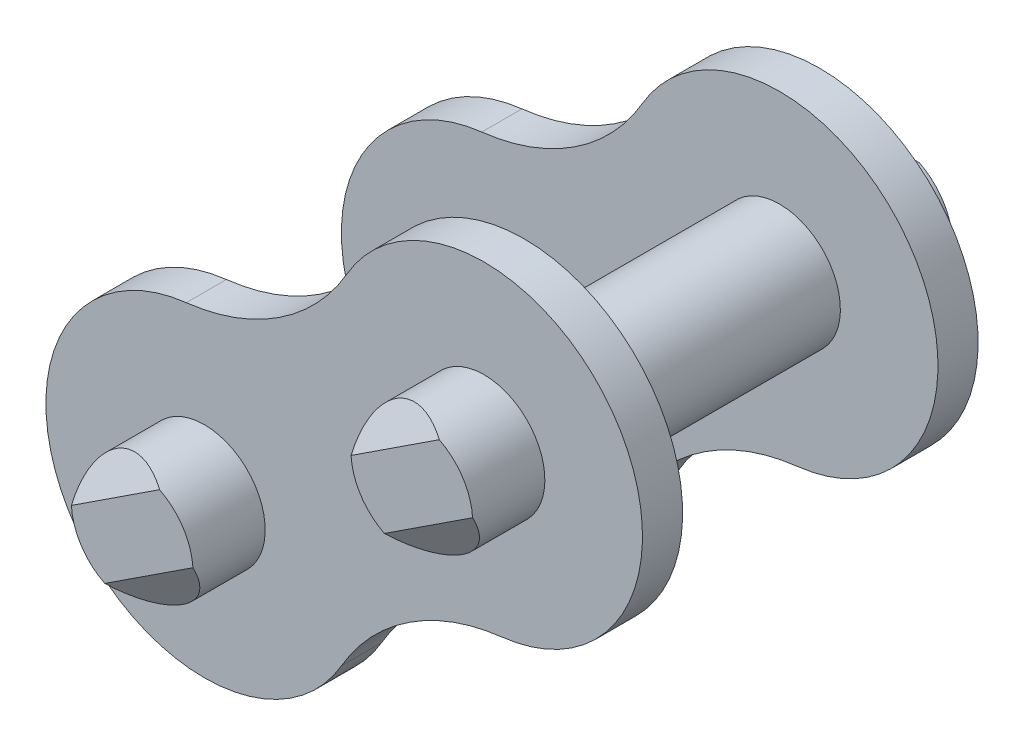
ISO-10303-21;
HEADER;
FILE_DESCRIPTION(('STEP AP214'),'2;1');
FILE_NAME('part.step','',(''),(''),'','','');
FILE_SCHEMA(('AUTOMOTIVE_DESIGN { 1 0 10303 214 1 1 1 1 }'));
ENDSEC;
DATA;
#1=APPLICATION_CONTEXT('core data for automotive mechanical design processes');
#2=APPLICATION_PROTOCOL_DEFINITION('international standard','automotive_design',2000,#1);
#3=PRODUCT_CONTEXT('',#1,'mechanical');
#4=PRODUCT('Part','Part','',(#3));
#5=PRODUCT_RELATED_PRODUCT_CATEGORY('part','',(#4));
#6=PRODUCT_DEFINITION_FORMATION('','',#4);
#7=PRODUCT_DEFINITION_CONTEXT('part definition',#1,'design');
#8=PRODUCT_DEFINITION('design','',#6,#7);
#9=PRODUCT_DEFINITION_SHAPE('','',#8);
#10=(LENGTH_UNIT() NAMED_UNIT(*) SI_UNIT(.MILLI.,.METRE.));
#11=(NAMED_UNIT(*) PLANE_ANGLE_UNIT() SI_UNIT($,.RADIAN.));
#12=(NAMED_UNIT(*) SI_UNIT($,.STERADIAN.) SOLID_ANGLE_UNIT());
#13=UNCERTAINTY_MEASURE_WITH_UNIT(LENGTH_MEASURE(1.E-05),#10,'distance_accuracy_value','');
#14=(GEOMETRIC_REPRESENTATION_CONTEXT(3) GLOBAL_UNCERTAINTY_ASSIGNED_CONTEXT((#13)) GLOBAL_UNIT_ASSIGNED_CONTEXT((#10,
#11,#12)) REPRESENTATION_CONTEXT('',''));
#15=CARTESIAN_POINT('',(0.,0.,0.));
#16=DIRECTION('',(0.,0.,1.));
#17=DIRECTION('',(1.,0.,0.));
#18=AXIS2_PLACEMENT_3D('',#15,#16,#17);
#19=CARTESIAN_POINT('',(79.0152137888915,913.622566745912,-131.392489073474));
#20=DIRECTION('',(0.273886737642536,-0.418313345404529,0.866025403784439));
#21=DIRECTION('',(-0.836626690809058,-0.547773475285072,0.));
#22=AXIS2_PLACEMENT_3D('',#19,#20,#21);
#23=PLANE('',#22);
#24=CARTESIAN_POINT('',(91.6233216253341,920.841571485645,-131.892921853051));
#25=DIRECTION('',(-0.273886737642536,0.418313345404529,-0.866025403784439));
#26=DIRECTION('',(-0.47438574511616,0.724539967724753,0.5));
#27=AXIS2_PLACEMENT_3D('',#24,#25,#26);
#28=ELLIPSE('',#27,1.3344874122049,1.1557);
#29=CARTESIAN_POINT('',(90.4694398819412,920.776768613298,-131.5593));
#30=VERTEX_POINT('',#29);
#31=CARTESIAN_POINT('',(92.1441415633402,921.87326382456,-131.5593));
#32=VERTEX_POINT('',#31);
#33=EDGE_CURVE('E254',#30,#32,#28,.T.);
#34=ORIENTED_EDGE('',*,*,#33,.T.);
#35=DIRECTION('',(0.836626690809058,0.547773475285072,0.));
#36=VECTOR('',#35,1.);
#37=CARTESIAN_POINT('',(79.1734792402382,913.38084437927,-131.5593));
#38=LINE('',#37,#36);
#39=EDGE_CURVE('E264',#30,#32,#38,.T.);
#40=ORIENTED_EDGE('',*,*,#39,.F.);
#41=EDGE_LOOP('',(#34,#40));
#42=FACE_BOUND('',#41,.T.);
#43=ADVANCED_FACE('F17',(#42),#23,.F.);
#44=CARTESIAN_POINT('',(79.9648064969719,912.172232546061,-131.392489073474));
#45=DIRECTION('',(0.273886737642537,-0.41831334540453,-0.866025403784438));
#46=DIRECTION('',(0.,-0.900457125334355,0.43494478435152));
#47=AXIS2_PLACEMENT_3D('',#44,#45,#46);
#48=PLANE('',#47);
#49=CARTESIAN_POINT('',(91.6233216253341,920.841571485645,-131.892921853051));
#50=DIRECTION('',(-0.273886737642537,0.418313345404529,0.866025403784439));
#51=DIRECTION('',(0.47438574511616,-0.724539967724752,0.5));
#52=AXIS2_PLACEMENT_3D('',#49,#50,#51);
#53=ELLIPSE('',#52,1.3344874122049,1.1557);
#54=CARTESIAN_POINT('',(91.1025016873281,919.80987914673,-131.5593));
#55=VERTEX_POINT('',#54);
#56=CARTESIAN_POINT('',(92.7772033687271,920.906374357992,-131.5593));
#57=VERTEX_POINT('',#56);
#58=EDGE_CURVE('E259',#55,#57,#53,.T.);
#59=ORIENTED_EDGE('',*,*,#58,.F.);
#60=DIRECTION('',(0.836626690809058,0.547773475285072,0.));
#61=VECTOR('',#60,1.);
#62=CARTESIAN_POINT('',(79.8065410456252,912.413954912702,-131.5593));
#63=LINE('',#62,#61);
#64=EDGE_CURVE('E267',#55,#57,#63,.T.);
#65=ORIENTED_EDGE('',*,*,#64,.T.);
#66=EDGE_LOOP('',(#59,#65));
#67=FACE_BOUND('',#66,.T.);
#68=ADVANCED_FACE('F446',(#67),#48,.T.);
#69=CARTESIAN_POINT('',(79.0152137888915,913.622566745912,-131.392489073474));
#70=DIRECTION('',(0.273886737642536,-0.418313345404529,0.866025403784439));
#71=DIRECTION('',(-0.836626690809058,-0.547773475285072,0.));
#72=AXIS2_PLACEMENT_3D('',#69,#70,#71);
#73=PLANE('',#72);
#74=CARTESIAN_POINT('',(96.9359011119717,924.319933053705,-131.892921853051));
#75=DIRECTION('',(-0.273886737642536,0.418313345404529,-0.866025403784439));
#76=DIRECTION('',(-0.47438574511616,0.724539967724753,0.5));
#77=AXIS2_PLACEMENT_3D('',#74,#75,#76);
#78=ELLIPSE('',#77,1.3344874122049,1.1557);
#79=CARTESIAN_POINT('',(95.7820193685787,924.255130181358,-131.5593));
#80=VERTEX_POINT('',#79);
#81=CARTESIAN_POINT('',(97.4567210499777,925.35162539262,-131.5593));
#82=VERTEX_POINT('',#81);
#83=EDGE_CURVE('E271',#80,#82,#78,.T.);
#84=ORIENTED_EDGE('',*,*,#83,.T.);
#85=DIRECTION('',(0.836626690809058,0.547773475285072,0.));
#86=VECTOR('',#85,1.);
#87=CARTESIAN_POINT('',(79.1734792402382,913.38084437927,-131.5593));
#88=LINE('',#87,#86);
#89=EDGE_CURVE('E293',#80,#82,#88,.T.);
#90=ORIENTED_EDGE('',*,*,#89,.F.);
#91=EDGE_LOOP('',(#84,#90));
#92=FACE_BOUND('',#91,.T.);
#93=ADVANCED_FACE('F451',(#92),#73,.F.);
#94=CARTESIAN_POINT('',(79.9648064969719,912.172232546061,-131.392489073474));
#95=DIRECTION('',(0.273886737642537,-0.41831334540453,-0.866025403784438));
#96=DIRECTION('',(0.,-0.900457125334355,0.43494478435152));
#97=AXIS2_PLACEMENT_3D('',#94,#95,#96);
#98=PLANE('',#97);
#99=CARTESIAN_POINT('',(96.9359011119717,924.319933053705,-131.892921853051));
#100=DIRECTION('',(-0.273886737642537,0.418313345404529,0.866025403784439));
#101=DIRECTION('',(0.47438574511616,-0.724539967724752,0.5));
#102=AXIS2_PLACEMENT_3D('',#99,#100,#101);
#103=ELLIPSE('',#102,1.3344874122049,1.1557);
#104=CARTESIAN_POINT('',(96.4150811739656,923.28824071479,-131.5593));
#105=VERTEX_POINT('',#104);
#106=CARTESIAN_POINT('',(98.0897828553646,924.384735926052,-131.5593));
#107=VERTEX_POINT('',#106);
#108=EDGE_CURVE('E279',#105,#107,#103,.T.);
#109=ORIENTED_EDGE('',*,*,#108,.F.);
#110=DIRECTION('',(0.836626690809058,0.547773475285072,0.));
#111=VECTOR('',#110,1.);
#112=CARTESIAN_POINT('',(79.8065410456252,912.413954912702,-131.5593));
#113=LINE('',#112,#111);
#114=EDGE_CURVE('E296',#105,#107,#113,.T.);
#115=ORIENTED_EDGE('',*,*,#114,.T.);
#116=EDGE_LOOP('',(#109,#115));
#117=FACE_BOUND('',#116,.T.);
#118=ADVANCED_FACE('F494',(#117),#98,.T.);
#119=CARTESIAN_POINT('',(94.2796113686529,922.580752269675,-129.4257));
#120=DIRECTION('',(0.,0.,-1.));
#121=DIRECTION('',(0.,-1.,0.));
#122=AXIS2_PLACEMENT_3D('',#119,#120,#121);
#123=PLANE('',#122);
#124=CARTESIAN_POINT('',(91.6233216253341,920.841571485645,-129.4257));
#125=DIRECTION('',(0.,0.,1.));
#126=DIRECTION('',(0.836626690809057,0.547773475285073,0.));
#127=AXIS2_PLACEMENT_3D('',#124,#125,#126);
#128=CIRCLE('',#127,1.1557);
#129=CARTESIAN_POINT('',(92.5902110919021,921.474633291032,-129.4257));
#130=VERTEX_POINT('',#129);
#131=EDGE_CURVE('E248',#130,#130,#128,.T.);
#132=ORIENTED_EDGE('',*,*,#131,.F.);
#133=EDGE_LOOP('',(#132));
#134=FACE_BOUND('',#133,.T.);
#135=CARTESIAN_POINT('',(96.9359011119717,924.319933053705,-129.4257));
#136=DIRECTION('',(0.,0.,1.));
#137=DIRECTION('',(0.836626690809057,0.547773475285073,0.));
#138=AXIS2_PLACEMENT_3D('',#135,#136,#137);
#139=CIRCLE('',#138,1.1557);
#140=CARTESIAN_POINT('',(97.9027905785397,924.952994859092,-129.4257));
#141=VERTEX_POINT('',#140);
#142=EDGE_CURVE('E245',#141,#141,#139,.T.);
#143=ORIENTED_EDGE('',*,*,#142,.F.);
#144=EDGE_LOOP('',(#143));
#145=FACE_BOUND('',#144,.T.);
#146=CARTESIAN_POINT('',(97.7426762179608,917.291535804008,-129.4257));
#147=DIRECTION('',(0.,0.,1.));
#148=DIRECTION('',(0.836626690809057,0.547773475285073,0.));
#149=AXIS2_PLACEMENT_3D('',#146,#147,#148);
#150=CIRCLE('',#149,4.06464973628698);
#151=CARTESIAN_POINT('',(97.2791473229724,921.329668843199,-129.4257));
#152=VERTEX_POINT('',#151);
#153=CARTESIAN_POINT('',(94.2268294208725,919.331192338354,-129.4257));
#154=VERTEX_POINT('',#153);
#155=EDGE_CURVE('E299',#152,#154,#150,.T.);
#156=ORIENTED_EDGE('',*,*,#155,.F.);
#157=CARTESIAN_POINT('',(96.9359011119717,924.319933053705,-129.4257));
#158=DIRECTION('',(0.,0.,1.));
#159=DIRECTION('',(0.836626690809057,0.547773475285073,0.));
#160=AXIS2_PLACEMENT_3D('',#157,#158,#159);
#161=CIRCLE('',#160,3.0099);
#162=CARTESIAN_POINT('',(94.3323933164333,925.830312200996,-129.4257));
#163=VERTEX_POINT('',#162);
#164=EDGE_CURVE('E234',#152,#163,#161,.T.);
#165=ORIENTED_EDGE('',*,*,#164,.T.);
#166=CARTESIAN_POINT('',(90.8165465193451,927.869968735342,-129.4257));
#167=DIRECTION('',(0.,0.,1.));
#168=DIRECTION('',(0.836626690809057,0.547773475285073,0.));
#169=AXIS2_PLACEMENT_3D('',#166,#167,#168);
#170=CIRCLE('',#169,4.06464973628691);
#171=CARTESIAN_POINT('',(91.2800754143334,923.831835696151,-129.4257));
#172=VERTEX_POINT('',#171);
#173=EDGE_CURVE('E284',#172,#163,#170,.T.);
#174=ORIENTED_EDGE('',*,*,#173,.F.);
#175=CARTESIAN_POINT('',(91.6233216253341,920.841571485645,-129.4257));
#176=DIRECTION('',(0.,0.,1.));
#177=DIRECTION('',(0.836626690809057,0.547773475285073,0.));
#178=AXIS2_PLACEMENT_3D('',#175,#176,#177);
#179=CIRCLE('',#178,3.0099);
#180=EDGE_CURVE('E25',#172,#154,#179,.T.);
#181=ORIENTED_EDGE('',*,*,#180,.T.);
#182=EDGE_LOOP('',(#156,#165,#174,#181));
#183=FACE_BOUND('',#182,.T.);
#184=ADVANCED_FACE('F490',(#134,#145,#183),#123,.F.);
#185=CARTESIAN_POINT('',(94.2796113686529,922.580752269675,-130.1877));
#186=DIRECTION('',(0.,0.,-1.));
#187=DIRECTION('',(0.,-1.,0.));
#188=AXIS2_PLACEMENT_3D('',#185,#186,#187);
#189=PLANE('',#188);
#190=CARTESIAN_POINT('',(91.6233216253341,920.841571485645,-130.1877));
#191=DIRECTION('',(0.,0.,1.));
#192=DIRECTION('',(0.836626690809057,0.547773475285073,0.));
#193=AXIS2_PLACEMENT_3D('',#190,#191,#192);
#194=CIRCLE('',#193,1.1557);
#195=CARTESIAN_POINT('',(92.5902110919021,921.474633291032,-130.1877));
#196=VERTEX_POINT('',#195);
#197=EDGE_CURVE('E251',#196,#196,#194,.T.);
#198=ORIENTED_EDGE('',*,*,#197,.T.);
#199=EDGE_LOOP('',(#198));
#200=FACE_BOUND('',#199,.T.);
#201=CARTESIAN_POINT('',(96.9359011119717,924.319933053705,-130.1877));
#202=DIRECTION('',(0.,0.,1.));
#203=DIRECTION('',(0.836626690809057,0.547773475285073,0.));
#204=AXIS2_PLACEMENT_3D('',#201,#202,#203);
#205=CIRCLE('',#204,1.1557);
#206=CARTESIAN_POINT('',(97.9027905785397,924.952994859092,-130.1877));
#207=VERTEX_POINT('',#206);
#208=EDGE_CURVE('E268',#207,#207,#205,.T.);
#209=ORIENTED_EDGE('',*,*,#208,.T.);
#210=EDGE_LOOP('',(#209));
#211=FACE_BOUND('',#210,.T.);
#212=CARTESIAN_POINT('',(97.7426762179608,917.291535804008,-130.1877));
#213=DIRECTION('',(0.,0.,1.));
#214=DIRECTION('',(0.836626690809057,0.547773475285073,0.));
#215=AXIS2_PLACEMENT_3D('',#212,#213,#214);
#216=CIRCLE('',#215,4.06464973628698);
#217=CARTESIAN_POINT('',(97.2791473229724,921.329668843199,-130.1877));
#218=VERTEX_POINT('',#217);
#219=CARTESIAN_POINT('',(94.2268294208725,919.331192338354,-130.1877));
#220=VERTEX_POINT('',#219);
#221=EDGE_CURVE('E235',#218,#220,#216,.T.);
#222=ORIENTED_EDGE('',*,*,#221,.T.);
#223=CARTESIAN_POINT('',(91.6233216253341,920.841571485645,-130.1877));
#224=DIRECTION('',(0.,0.,1.));
#225=DIRECTION('',(0.836626690809057,0.547773475285073,0.));
#226=AXIS2_PLACEMENT_3D('',#223,#224,#225);
#227=CIRCLE('',#226,3.0099);
#228=CARTESIAN_POINT('',(91.2800754143334,923.831835696151,-130.1877));
#229=VERTEX_POINT('',#228);
#230=EDGE_CURVE('E11',#229,#220,#227,.T.);
#231=ORIENTED_EDGE('',*,*,#230,.F.);
#232=CARTESIAN_POINT('',(90.8165465193451,927.869968735342,-130.1877));
#233=DIRECTION('',(0.,0.,1.));
#234=DIRECTION('',(0.836626690809057,0.547773475285073,0.));
#235=AXIS2_PLACEMENT_3D('',#232,#233,#234);
#236=CIRCLE('',#235,4.06464973628691);
#237=CARTESIAN_POINT('',(94.3323933164333,925.830312200996,-130.1877));
#238=VERTEX_POINT('',#237);
#239=EDGE_CURVE('E314',#229,#238,#236,.T.);
#240=ORIENTED_EDGE('',*,*,#239,.T.);
#241=CARTESIAN_POINT('',(96.9359011119717,924.319933053705,-130.1877));
#242=DIRECTION('',(0.,0.,1.));
#243=DIRECTION('',(0.836626690809057,0.547773475285073,0.));
#244=AXIS2_PLACEMENT_3D('',#241,#242,#243);
#245=CIRCLE('',#244,3.0099);
#246=EDGE_CURVE('E285',#218,#238,#245,.T.);
#247=ORIENTED_EDGE('',*,*,#246,.F.);
#248=EDGE_LOOP('',(#222,#231,#240,#247));
#249=FACE_BOUND('',#248,.T.);
#250=ADVANCED_FACE('F487',(#200,#211,#249),#189,.T.);
#251=CARTESIAN_POINT('',(91.6233216253341,920.841571485645,-130.1877));
#252=DIRECTION('',(0.,0.,1.));
#253=DIRECTION('',(-0.836626690809057,-0.547773475285073,0.));
#254=AXIS2_PLACEMENT_3D('',#251,#252,#253);
#255=CYLINDRICAL_SURFACE('',#254,3.0099);
#256=ORIENTED_EDGE('',*,*,#180,.F.);
#257=DIRECTION('',(0.,0.,1.));
#258=VECTOR('',#257,1.);
#259=CARTESIAN_POINT('',(91.2800754143334,923.831835696151,-130.1877));
#260=LINE('',#259,#258);
#261=EDGE_CURVE('E316',#229,#172,#260,.T.);
#262=ORIENTED_EDGE('',*,*,#261,.F.);
#263=ORIENTED_EDGE('',*,*,#230,.T.);
#264=DIRECTION('',(0.,0.,1.));
#265=VECTOR('',#264,1.);
#266=CARTESIAN_POINT('',(94.2268294208725,919.331192338354,-130.1877));
#267=LINE('',#266,#265);
#268=EDGE_CURVE('E303',#220,#154,#267,.T.);
#269=ORIENTED_EDGE('',*,*,#268,.T.);
#270=EDGE_LOOP('',(#256,#262,#263,#269));
#271=FACE_BOUND('',#270,.T.);
#272=ADVANCED_FACE('F486',(#271),#255,.T.);
#273=CARTESIAN_POINT('',(90.8165465193451,927.869968735342,-130.1877));
#274=DIRECTION('',(0.,0.,1.));
#275=DIRECTION('',(-0.836626690809057,-0.547773475285073,0.));
#276=AXIS2_PLACEMENT_3D('',#273,#274,#275);
#277=CYLINDRICAL_SURFACE('',#276,4.06464973628691);
#278=ORIENTED_EDGE('',*,*,#173,.T.);
#279=DIRECTION('',(0.,0.,1.));
#280=VECTOR('',#279,1.);
#281=CARTESIAN_POINT('',(94.3323933164333,925.830312200996,-130.1877));
#282=LINE('',#281,#280);
#283=EDGE_CURVE('E280',#238,#163,#282,.T.);
#284=ORIENTED_EDGE('',*,*,#283,.F.);
#285=ORIENTED_EDGE('',*,*,#239,.F.);
#286=ORIENTED_EDGE('',*,*,#261,.T.);
#287=EDGE_LOOP('',(#278,#284,#285,#286));
#288=FACE_BOUND('',#287,.T.);
#289=ADVANCED_FACE('F482',(#288),#277,.F.);
#290=CARTESIAN_POINT('',(96.9359011119717,924.319933053705,-130.1877));
#291=DIRECTION('',(0.,0.,1.));
#292=DIRECTION('',(-0.836626690809057,-0.547773475285073,0.));
#293=AXIS2_PLACEMENT_3D('',#290,#291,#292);
#294=CYLINDRICAL_SURFACE('',#293,3.0099);
#295=ORIENTED_EDGE('',*,*,#164,.F.);
#296=DIRECTION('',(0.,0.,1.));
#297=VECTOR('',#296,1.);
#298=CARTESIAN_POINT('',(97.2791473229724,921.329668843199,-130.1877));
#299=LINE('',#298,#297);
#300=EDGE_CURVE('E232',#218,#152,#299,.T.);
#301=ORIENTED_EDGE('',*,*,#300,.F.);
#302=ORIENTED_EDGE('',*,*,#246,.T.);
#303=ORIENTED_EDGE('',*,*,#283,.T.);
#304=EDGE_LOOP('',(#295,#301,#302,#303));
#305=FACE_BOUND('',#304,.T.);
#306=ADVANCED_FACE('F478',(#305),#294,.T.);
#307=CARTESIAN_POINT('',(97.7426762179608,917.291535804008,-130.1877));
#308=DIRECTION('',(0.,0.,1.));
#309=DIRECTION('',(-0.836626690809057,-0.547773475285073,0.));
#310=AXIS2_PLACEMENT_3D('',#307,#308,#309);
#311=CYLINDRICAL_SURFACE('',#310,4.06464973628698);
#312=ORIENTED_EDGE('',*,*,#155,.T.);
#313=ORIENTED_EDGE('',*,*,#268,.F.);
#314=ORIENTED_EDGE('',*,*,#221,.F.);
#315=ORIENTED_EDGE('',*,*,#300,.T.);
#316=EDGE_LOOP('',(#312,#313,#314,#315));
#317=FACE_BOUND('',#316,.T.);
#318=ADVANCED_FACE('F475',(#317),#311,.F.);
#319=CARTESIAN_POINT('',(94.2796113686529,922.580752269675,-131.5593));
#320=DIRECTION('',(0.,0.,-1.));
#321=DIRECTION('',(0.,-1.,0.));
#322=AXIS2_PLACEMENT_3D('',#319,#320,#321);
#323=PLANE('',#322);
#324=ORIENTED_EDGE('',*,*,#89,.T.);
#325=CARTESIAN_POINT('',(96.9359011119717,924.319933053705,-131.5593));
#326=DIRECTION('',(0.,0.,1.));
#327=DIRECTION('',(0.836626690809057,0.547773475285073,0.));
#328=AXIS2_PLACEMENT_3D('',#325,#326,#327);
#329=CIRCLE('',#328,1.1557);
#330=EDGE_CURVE('E289',#107,#82,#329,.T.);
#331=ORIENTED_EDGE('',*,*,#330,.F.);
#332=ORIENTED_EDGE('',*,*,#114,.F.);
#333=CARTESIAN_POINT('',(96.9359011119717,924.319933053705,-131.5593));
#334=DIRECTION('',(0.,0.,1.));
#335=DIRECTION('',(0.836626690809057,0.547773475285073,0.));
#336=AXIS2_PLACEMENT_3D('',#333,#334,#335);
#337=CIRCLE('',#336,1.1557);
#338=EDGE_CURVE('E275',#80,#105,#337,.T.);
#339=ORIENTED_EDGE('',*,*,#338,.F.);
#340=EDGE_LOOP('',(#324,#331,#332,#339));
#341=FACE_BOUND('',#340,.T.);
#342=ADVANCED_FACE('F470',(#341),#323,.T.);
#343=CARTESIAN_POINT('',(96.9359011119717,924.319933053705,-131.5593));
#344=DIRECTION('',(0.,0.,1.));
#345=DIRECTION('',(-0.836626690809057,-0.547773475285073,0.));
#346=AXIS2_PLACEMENT_3D('',#343,#344,#345);
#347=CYLINDRICAL_SURFACE('',#346,1.1557);
#348=ORIENTED_EDGE('',*,*,#83,.F.);
#349=ORIENTED_EDGE('',*,*,#338,.T.);
#350=ORIENTED_EDGE('',*,*,#108,.T.);
#351=ORIENTED_EDGE('',*,*,#330,.T.);
#352=EDGE_LOOP('',(#348,#349,#350,#351));
#353=FACE_BOUND('',#352,.T.);
#354=ORIENTED_EDGE('',*,*,#208,.F.);
#355=EDGE_LOOP('',(#354));
#356=FACE_BOUND('',#355,.T.);
#357=ADVANCED_FACE('F463',(#353,#356),#347,.T.);
#358=CARTESIAN_POINT('',(94.2796113686529,922.580752269675,-131.5593));
#359=DIRECTION('',(0.,0.,-1.));
#360=DIRECTION('',(0.,-1.,0.));
#361=AXIS2_PLACEMENT_3D('',#358,#359,#360);
#362=PLANE('',#361);
#363=ORIENTED_EDGE('',*,*,#39,.T.);
#364=CARTESIAN_POINT('',(91.6233216253341,920.841571485645,-131.5593));
#365=DIRECTION('',(0.,0.,1.));
#366=DIRECTION('',(0.836626690809057,0.547773475285073,0.));
#367=AXIS2_PLACEMENT_3D('',#364,#365,#366);
#368=CIRCLE('',#367,1.1557);
#369=EDGE_CURVE('E260',#57,#32,#368,.T.);
#370=ORIENTED_EDGE('',*,*,#369,.F.);
#371=ORIENTED_EDGE('',*,*,#64,.F.);
#372=CARTESIAN_POINT('',(91.6233216253341,920.841571485645,-131.5593));
#373=DIRECTION('',(0.,0.,1.));
#374=DIRECTION('',(0.836626690809057,0.547773475285073,0.));
#375=AXIS2_PLACEMENT_3D('',#372,#373,#374);
#376=CIRCLE('',#375,1.1557);
#377=EDGE_CURVE('E255',#30,#55,#376,.T.);
#378=ORIENTED_EDGE('',*,*,#377,.F.);
#379=EDGE_LOOP('',(#363,#370,#371,#378));
#380=FACE_BOUND('',#379,.T.);
#381=ADVANCED_FACE('F461',(#380),#362,.T.);
#382=CARTESIAN_POINT('',(91.6233216253341,920.841571485645,-131.5593));
#383=DIRECTION('',(0.,0.,1.));
#384=DIRECTION('',(-0.836626690809057,-0.547773475285073,0.));
#385=AXIS2_PLACEMENT_3D('',#382,#383,#384);
#386=CYLINDRICAL_SURFACE('',#385,1.1557);
#387=ORIENTED_EDGE('',*,*,#33,.F.);
#388=ORIENTED_EDGE('',*,*,#377,.T.);
#389=ORIENTED_EDGE('',*,*,#58,.T.);
#390=ORIENTED_EDGE('',*,*,#369,.T.);
#391=EDGE_LOOP('',(#387,#388,#389,#390));
#392=FACE_BOUND('',#391,.T.);
#393=ORIENTED_EDGE('',*,*,#197,.F.);
#394=EDGE_LOOP('',(#393));
#395=FACE_BOUND('',#394,.T.);
#396=ADVANCED_FACE('F456',(#392,#395),#386,.T.);
#397=CARTESIAN_POINT('',(79.0152137888915,913.622566745912,-122.607510926526));
#398=DIRECTION('',(0.273886737642536,-0.418313345404529,-0.866025403784439));
#399=DIRECTION('',(0.,-0.900457125334356,0.434944784351518));
#400=AXIS2_PLACEMENT_3D('',#397,#398,#399);
#401=PLANE('',#400);
#402=CARTESIAN_POINT('',(91.6233216253341,920.841571485645,-122.107078146949));
#403=DIRECTION('',(0.273886737642536,-0.418313345404529,-0.866025403784439));
#404=DIRECTION('',(-0.47438574511616,0.724539967724753,-0.5));
#405=AXIS2_PLACEMENT_3D('',#402,#403,#404);
#406=ELLIPSE('',#405,1.3344874122049,1.1557);
#407=CARTESIAN_POINT('',(90.4694398819412,920.776768613298,-122.4407));
#408=VERTEX_POINT('',#407);
#409=CARTESIAN_POINT('',(92.1441415633402,921.87326382456,-122.4407));
#410=VERTEX_POINT('',#409);
#411=EDGE_CURVE('E333',#408,#410,#406,.T.);
#412=ORIENTED_EDGE('',*,*,#411,.F.);
#413=DIRECTION('',(0.836626690809058,0.547773475285072,0.));
#414=VECTOR('',#413,1.);
#415=CARTESIAN_POINT('',(79.1734792402382,913.38084437927,-122.4407));
#416=LINE('',#415,#414);
#417=EDGE_CURVE('E352',#408,#410,#416,.T.);
#418=ORIENTED_EDGE('',*,*,#417,.T.);
#419=EDGE_LOOP('',(#412,#418));
#420=FACE_BOUND('',#419,.T.);
#421=ADVANCED_FACE('F441',(#420),#401,.F.);
#422=CARTESIAN_POINT('',(79.9648064969719,912.172232546061,-122.607510926526));
#423=DIRECTION('',(0.273886737642537,-0.41831334540453,0.866025403784438));
#424=DIRECTION('',(-0.836626690809057,-0.547773475285072,0.));
#425=AXIS2_PLACEMENT_3D('',#422,#423,#424);
#426=PLANE('',#425);
#427=CARTESIAN_POINT('',(91.6233216253341,920.841571485645,-122.107078146949));
#428=DIRECTION('',(0.273886737642537,-0.418313345404529,0.866025403784439));
#429=DIRECTION('',(0.47438574511616,-0.724539967724752,-0.5));
#430=AXIS2_PLACEMENT_3D('',#427,#428,#429);
#431=ELLIPSE('',#430,1.3344874122049,1.1557);
#432=CARTESIAN_POINT('',(91.1025016873281,919.80987914673,-122.4407));
#433=VERTEX_POINT('',#432);
#434=CARTESIAN_POINT('',(92.7772033687271,920.906374357992,-122.4407));
#435=VERTEX_POINT('',#434);
#436=EDGE_CURVE('E344',#433,#435,#431,.T.);
#437=ORIENTED_EDGE('',*,*,#436,.T.);
#438=DIRECTION('',(0.836626690809058,0.547773475285072,0.));
#439=VECTOR('',#438,1.);
#440=CARTESIAN_POINT('',(79.8065410456252,912.413954912702,-122.4407));
#441=LINE('',#440,#439);
#442=EDGE_CURVE('E355',#433,#435,#441,.T.);
#443=ORIENTED_EDGE('',*,*,#442,.F.);
#444=EDGE_LOOP('',(#437,#443));
#445=FACE_BOUND('',#444,.T.);
#446=ADVANCED_FACE('F432',(#445),#426,.T.);
#447=CARTESIAN_POINT('',(79.0152137888915,913.622566745912,-122.607510926526));
#448=DIRECTION('',(0.273886737642536,-0.418313345404529,-0.866025403784439));
#449=DIRECTION('',(0.,-0.900457125334356,0.434944784351518));
#450=AXIS2_PLACEMENT_3D('',#447,#448,#449);
#451=PLANE('',#450);
#452=CARTESIAN_POINT('',(96.9359011119717,924.319933053705,-122.107078146949));
#453=DIRECTION('',(0.273886737642536,-0.418313345404529,-0.866025403784439));
#454=DIRECTION('',(-0.47438574511616,0.724539967724753,-0.5));
#455=AXIS2_PLACEMENT_3D('',#452,#453,#454);
#456=ELLIPSE('',#455,1.3344874122049,1.1557);
#457=CARTESIAN_POINT('',(95.7820193685787,924.255130181358,-122.4407));
#458=VERTEX_POINT('',#457);
#459=CARTESIAN_POINT('',(97.4567210499777,925.35162539262,-122.4407));
#460=VERTEX_POINT('',#459);
#461=EDGE_CURVE('E366',#458,#460,#456,.T.);
#462=ORIENTED_EDGE('',*,*,#461,.F.);
#463=DIRECTION('',(0.836626690809058,0.547773475285072,0.));
#464=VECTOR('',#463,1.);
#465=CARTESIAN_POINT('',(79.1734792402382,913.38084437927,-122.4407));
#466=LINE('',#465,#464);
#467=EDGE_CURVE('E331',#458,#460,#466,.T.);
#468=ORIENTED_EDGE('',*,*,#467,.T.);
#469=EDGE_LOOP('',(#462,#468));
#470=FACE_BOUND('',#469,.T.);
#471=ADVANCED_FACE('F427',(#470),#451,.F.);
#472=CARTESIAN_POINT('',(79.9648064969719,912.172232546061,-122.607510926526));
#473=DIRECTION('',(0.273886737642537,-0.41831334540453,0.866025403784438));
#474=DIRECTION('',(-0.836626690809057,-0.547773475285072,0.));
#475=AXIS2_PLACEMENT_3D('',#472,#473,#474);
#476=PLANE('',#475);
#477=CARTESIAN_POINT('',(96.9359011119717,924.319933053705,-122.107078146949));
#478=DIRECTION('',(0.273886737642537,-0.418313345404529,0.866025403784439));
#479=DIRECTION('',(0.47438574511616,-0.724539967724752,-0.5));
#480=AXIS2_PLACEMENT_3D('',#477,#478,#479);
#481=ELLIPSE('',#480,1.3344874122049,1.1557);
#482=CARTESIAN_POINT('',(96.4150811739656,923.28824071479,-122.4407));
#483=VERTEX_POINT('',#482);
#484=CARTESIAN_POINT('',(98.0897828553646,924.384735926052,-122.4407));
#485=VERTEX_POINT('',#484);
#486=EDGE_CURVE('E378',#483,#485,#481,.T.);
#487=ORIENTED_EDGE('',*,*,#486,.T.);
#488=DIRECTION('',(0.836626690809058,0.547773475285072,0.));
#489=VECTOR('',#488,1.);
#490=CARTESIAN_POINT('',(79.8065410456252,912.413954912702,-122.4407));
#491=LINE('',#490,#489);
#492=EDGE_CURVE('E405',#483,#485,#491,.T.);
#493=ORIENTED_EDGE('',*,*,#492,.F.);
#494=EDGE_LOOP('',(#487,#493));
#495=FACE_BOUND('',#494,.T.);
#496=ADVANCED_FACE('F418',(#495),#476,.T.);
#497=CARTESIAN_POINT('',(91.6233216253341,920.841571485645,-122.4407));
#498=DIRECTION('',(0.,0.,-1.));
#499=DIRECTION('',(-0.836626690809057,-0.547773475285073,0.));
#500=AXIS2_PLACEMENT_3D('',#497,#498,#499);
#501=CYLINDRICAL_SURFACE('',#500,1.1557);
#502=ORIENTED_EDGE('',*,*,#131,.T.);
#503=EDGE_LOOP('',(#502));
#504=FACE_BOUND('',#503,.T.);
#505=CARTESIAN_POINT('',(91.6233216253341,920.841571485645,-124.5743));
#506=DIRECTION('',(0.,0.,1.));
#507=DIRECTION('',(0.836626690809057,0.547773475285073,0.));
#508=AXIS2_PLACEMENT_3D('',#505,#506,#507);
#509=CIRCLE('',#508,1.1557);
#510=CARTESIAN_POINT('',(92.5902110919021,921.474633291032,-124.5743));
#511=VERTEX_POINT('',#510);
#512=EDGE_CURVE('E244',#511,#511,#509,.T.);
#513=ORIENTED_EDGE('',*,*,#512,.F.);
#514=EDGE_LOOP('',(#513));
#515=FACE_BOUND('',#514,.T.);
#516=ADVANCED_FACE('F439',(#504,#515),#501,.T.);
#517=CARTESIAN_POINT('',(96.9359011119717,924.319933053705,-122.4407));
#518=DIRECTION('',(0.,0.,-1.));
#519=DIRECTION('',(-0.836626690809057,-0.547773475285073,0.));
#520=AXIS2_PLACEMENT_3D('',#517,#518,#519);
#521=CYLINDRICAL_SURFACE('',#520,1.1557);
#522=ORIENTED_EDGE('',*,*,#142,.T.);
#523=EDGE_LOOP('',(#522));
#524=FACE_BOUND('',#523,.T.);
#525=CARTESIAN_POINT('',(96.9359011119717,924.319933053705,-124.5743));
#526=DIRECTION('',(0.,0.,1.));
#527=DIRECTION('',(0.836626690809057,0.547773475285073,0.));
#528=AXIS2_PLACEMENT_3D('',#525,#526,#527);
#529=CIRCLE('',#528,1.1557);
#530=CARTESIAN_POINT('',(97.9027905785397,924.952994859092,-124.5743));
#531=VERTEX_POINT('',#530);
#532=EDGE_CURVE('E241',#531,#531,#529,.T.);
#533=ORIENTED_EDGE('',*,*,#532,.F.);
#534=EDGE_LOOP('',(#533));
#535=FACE_BOUND('',#534,.T.);
#536=ADVANCED_FACE('F514',(#524,#535),#521,.T.);
#537=CARTESIAN_POINT('',(94.2796113686529,922.580752269675,-124.5743));
#538=DIRECTION('',(0.,0.,1.));
#539=DIRECTION('',(1.,0.,0.));
#540=AXIS2_PLACEMENT_3D('',#537,#538,#539);
#541=PLANE('',#540);
#542=ORIENTED_EDGE('',*,*,#512,.T.);
#543=EDGE_LOOP('',(#542));
#544=FACE_BOUND('',#543,.T.);
#545=ORIENTED_EDGE('',*,*,#532,.T.);
#546=EDGE_LOOP('',(#545));
#547=FACE_BOUND('',#546,.T.);
#548=CARTESIAN_POINT('',(97.7426762179608,917.291535804008,-124.5743));
#549=DIRECTION('',(0.,0.,1.));
#550=DIRECTION('',(0.836626690809057,0.547773475285073,0.));
#551=AXIS2_PLACEMENT_3D('',#548,#549,#550);
#552=CIRCLE('',#551,4.06464973628698);
#553=CARTESIAN_POINT('',(97.2791473229724,921.329668843199,-124.5743));
#554=VERTEX_POINT('',#553);
#555=CARTESIAN_POINT('',(94.2268294208725,919.331192338354,-124.5743));
#556=VERTEX_POINT('',#555);
#557=EDGE_CURVE('E203',#554,#556,#552,.T.);
#558=ORIENTED_EDGE('',*,*,#557,.T.);
#559=CARTESIAN_POINT('',(91.6233216253341,920.841571485645,-124.5743));
#560=DIRECTION('',(0.,0.,1.));
#561=DIRECTION('',(0.836626690809057,0.547773475285073,0.));
#562=AXIS2_PLACEMENT_3D('',#559,#560,#561);
#563=CIRCLE('',#562,3.0099);
#564=CARTESIAN_POINT('',(91.2800754143334,923.831835696151,-124.5743));
#565=VERTEX_POINT('',#564);
#566=EDGE_CURVE('E196',#565,#556,#563,.T.);
#567=ORIENTED_EDGE('',*,*,#566,.F.);
#568=CARTESIAN_POINT('',(90.8165465193451,927.869968735342,-124.5743));
#569=DIRECTION('',(0.,0.,1.));
#570=DIRECTION('',(0.836626690809057,0.547773475285073,0.));
#571=AXIS2_PLACEMENT_3D('',#568,#569,#570);
#572=CIRCLE('',#571,4.06464973628691);
#573=CARTESIAN_POINT('',(94.3323933164333,925.830312200996,-124.5743));
#574=VERTEX_POINT('',#573);
#575=EDGE_CURVE('E200',#565,#574,#572,.T.);
#576=ORIENTED_EDGE('',*,*,#575,.T.);
#577=CARTESIAN_POINT('',(96.9359011119717,924.319933053705,-124.5743));
#578=DIRECTION('',(0.,0.,1.));
#579=DIRECTION('',(0.836626690809057,0.547773475285073,0.));
#580=AXIS2_PLACEMENT_3D('',#577,#578,#579);
#581=CIRCLE('',#580,3.0099);
#582=EDGE_CURVE('E391',#554,#574,#581,.T.);
#583=ORIENTED_EDGE('',*,*,#582,.F.);
#584=EDGE_LOOP('',(#558,#567,#576,#583));
#585=FACE_BOUND('',#584,.T.);
#586=ADVANCED_FACE('F198',(#544,#547,#585),#541,.F.);
#587=CARTESIAN_POINT('',(94.2796113686529,922.580752269675,-123.8123));
#588=DIRECTION('',(0.,0.,1.));
#589=DIRECTION('',(1.,0.,0.));
#590=AXIS2_PLACEMENT_3D('',#587,#588,#589);
#591=PLANE('',#590);
#592=CARTESIAN_POINT('',(91.6233216253341,920.841571485645,-123.8123));
#593=DIRECTION('',(0.,0.,1.));
#594=DIRECTION('',(0.836626690809057,0.547773475285073,0.));
#595=AXIS2_PLACEMENT_3D('',#592,#593,#594);
#596=CIRCLE('',#595,1.1557);
#597=CARTESIAN_POINT('',(92.5902110919021,921.474633291032,-123.8123));
#598=VERTEX_POINT('',#597);
#599=EDGE_CURVE('E337',#598,#598,#596,.T.);
#600=ORIENTED_EDGE('',*,*,#599,.F.);
#601=EDGE_LOOP('',(#600));
#602=FACE_BOUND('',#601,.T.);
#603=CARTESIAN_POINT('',(96.9359011119717,924.319933053705,-123.8123));
#604=DIRECTION('',(0.,0.,1.));
#605=DIRECTION('',(0.836626690809057,0.547773475285073,0.));
#606=AXIS2_PLACEMENT_3D('',#603,#604,#605);
#607=CIRCLE('',#606,1.1557);
#608=CARTESIAN_POINT('',(97.9027905785397,924.952994859092,-123.8123));
#609=VERTEX_POINT('',#608);
#610=EDGE_CURVE('E360',#609,#609,#607,.T.);
#611=ORIENTED_EDGE('',*,*,#610,.F.);
#612=EDGE_LOOP('',(#611));
#613=FACE_BOUND('',#612,.T.);
#614=CARTESIAN_POINT('',(97.7426762179608,917.291535804008,-123.8123));
#615=DIRECTION('',(0.,0.,1.));
#616=DIRECTION('',(0.836626690809057,0.547773475285073,0.));
#617=AXIS2_PLACEMENT_3D('',#614,#615,#616);
#618=CIRCLE('',#617,4.06464973628698);
#619=CARTESIAN_POINT('',(97.2791473229724,921.329668843199,-123.8123));
#620=VERTEX_POINT('',#619);
#621=CARTESIAN_POINT('',(94.2268294208725,919.331192338354,-123.8123));
#622=VERTEX_POINT('',#621);
#623=EDGE_CURVE('E383',#620,#622,#618,.T.);
#624=ORIENTED_EDGE('',*,*,#623,.F.);
#625=CARTESIAN_POINT('',(96.9359011119717,924.319933053705,-123.8123));
#626=DIRECTION('',(0.,0.,1.));
#627=DIRECTION('',(0.836626690809057,0.547773475285073,0.));
#628=AXIS2_PLACEMENT_3D('',#625,#626,#627);
#629=CIRCLE('',#628,3.0099);
#630=CARTESIAN_POINT('',(94.3323933164333,925.830312200996,-123.8123));
#631=VERTEX_POINT('',#630);
#632=EDGE_CURVE('E223',#620,#631,#629,.T.);
#633=ORIENTED_EDGE('',*,*,#632,.T.);
#634=CARTESIAN_POINT('',(90.8165465193451,927.869968735342,-123.8123));
#635=DIRECTION('',(0.,0.,1.));
#636=DIRECTION('',(0.836626690809057,0.547773475285073,0.));
#637=AXIS2_PLACEMENT_3D('',#634,#635,#636);
#638=CIRCLE('',#637,4.06464973628691);
#639=CARTESIAN_POINT('',(91.2800754143334,923.831835696151,-123.8123));
#640=VERTEX_POINT('',#639);
#641=EDGE_CURVE('E209',#640,#631,#638,.T.);
#642=ORIENTED_EDGE('',*,*,#641,.F.);
#643=CARTESIAN_POINT('',(91.6233216253341,920.841571485645,-123.8123));
#644=DIRECTION('',(0.,0.,1.));
#645=DIRECTION('',(0.836626690809057,0.547773475285073,0.));
#646=AXIS2_PLACEMENT_3D('',#643,#644,#645);
#647=CIRCLE('',#646,3.0099);
#648=EDGE_CURVE('E208',#640,#622,#647,.T.);
#649=ORIENTED_EDGE('',*,*,#648,.T.);
#650=EDGE_LOOP('',(#624,#633,#642,#649));
#651=FACE_BOUND('',#650,.T.);
#652=ADVANCED_FACE('F520',(#602,#613,#651),#591,.T.);
#653=CARTESIAN_POINT('',(91.6233216253341,920.841571485645,-123.8123));
#654=DIRECTION('',(0.,0.,-1.));
#655=DIRECTION('',(-0.836626690809057,-0.547773475285073,0.));
#656=AXIS2_PLACEMENT_3D('',#653,#654,#655);
#657=CYLINDRICAL_SURFACE('',#656,3.0099);
#658=ORIENTED_EDGE('',*,*,#566,.T.);
#659=DIRECTION('',(0.,0.,-1.));
#660=VECTOR('',#659,1.);
#661=CARTESIAN_POINT('',(94.2268294208725,919.331192338354,-123.8123));
#662=LINE('',#661,#660);
#663=EDGE_CURVE('E387',#622,#556,#662,.T.);
#664=ORIENTED_EDGE('',*,*,#663,.F.);
#665=ORIENTED_EDGE('',*,*,#648,.F.);
#666=DIRECTION('',(0.,0.,-1.));
#667=VECTOR('',#666,1.);
#668=CARTESIAN_POINT('',(91.2800754143334,923.831835696151,-123.8123));
#669=LINE('',#668,#667);
#670=EDGE_CURVE('E212',#640,#565,#669,.T.);
#671=ORIENTED_EDGE('',*,*,#670,.T.);
#672=EDGE_LOOP('',(#658,#664,#665,#671));
#673=FACE_BOUND('',#672,.T.);
#674=ADVANCED_FACE('F213',(#673),#657,.T.);
#675=CARTESIAN_POINT('',(90.8165465193451,927.869968735342,-123.8123));
#676=DIRECTION('',(0.,0.,-1.));
#677=DIRECTION('',(-0.836626690809057,-0.547773475285073,0.));
#678=AXIS2_PLACEMENT_3D('',#675,#676,#677);
#679=CYLINDRICAL_SURFACE('',#678,4.06464973628691);
#680=ORIENTED_EDGE('',*,*,#575,.F.);
#681=ORIENTED_EDGE('',*,*,#670,.F.);
#682=ORIENTED_EDGE('',*,*,#641,.T.);
#683=DIRECTION('',(0.,0.,-1.));
#684=VECTOR('',#683,1.);
#685=CARTESIAN_POINT('',(94.3323933164333,925.830312200996,-123.8123));
#686=LINE('',#685,#684);
#687=EDGE_CURVE('E220',#631,#574,#686,.T.);
#688=ORIENTED_EDGE('',*,*,#687,.T.);
#689=EDGE_LOOP('',(#680,#681,#682,#688));
#690=FACE_BOUND('',#689,.T.);
#691=ADVANCED_FACE('F218',(#690),#679,.F.);
#692=CARTESIAN_POINT('',(96.9359011119717,924.319933053705,-123.8123));
#693=DIRECTION('',(0.,0.,-1.));
#694=DIRECTION('',(-0.836626690809057,-0.547773475285073,0.));
#695=AXIS2_PLACEMENT_3D('',#692,#693,#694);
#696=CYLINDRICAL_SURFACE('',#695,3.0099);
#697=ORIENTED_EDGE('',*,*,#582,.T.);
#698=ORIENTED_EDGE('',*,*,#687,.F.);
#699=ORIENTED_EDGE('',*,*,#632,.F.);
#700=DIRECTION('',(0.,0.,-1.));
#701=VECTOR('',#700,1.);
#702=CARTESIAN_POINT('',(97.2791473229724,921.329668843199,-123.8123));
#703=LINE('',#702,#701);
#704=EDGE_CURVE('E388',#620,#554,#703,.T.);
#705=ORIENTED_EDGE('',*,*,#704,.T.);
#706=EDGE_LOOP('',(#697,#698,#699,#705));
#707=FACE_BOUND('',#706,.T.);
#708=ADVANCED_FACE('F397',(#707),#696,.T.);
#709=CARTESIAN_POINT('',(97.7426762179608,917.291535804008,-123.8123));
#710=DIRECTION('',(0.,0.,-1.));
#711=DIRECTION('',(-0.836626690809057,-0.547773475285073,0.));
#712=AXIS2_PLACEMENT_3D('',#709,#710,#711);
#713=CYLINDRICAL_SURFACE('',#712,4.06464973628698);
#714=ORIENTED_EDGE('',*,*,#557,.F.);
#715=ORIENTED_EDGE('',*,*,#704,.F.);
#716=ORIENTED_EDGE('',*,*,#623,.T.);
#717=ORIENTED_EDGE('',*,*,#663,.T.);
#718=EDGE_LOOP('',(#714,#715,#716,#717));
#719=FACE_BOUND('',#718,.T.);
#720=ADVANCED_FACE('F403',(#719),#713,.F.);
#721=CARTESIAN_POINT('',(94.2796113686529,922.580752269675,-122.4407));
#722=DIRECTION('',(0.,0.,1.));
#723=DIRECTION('',(1.,0.,0.));
#724=AXIS2_PLACEMENT_3D('',#721,#722,#723);
#725=PLANE('',#724);
#726=ORIENTED_EDGE('',*,*,#467,.F.);
#727=CARTESIAN_POINT('',(96.9359011119717,924.319933053705,-122.4407));
#728=DIRECTION('',(0.,0.,1.));
#729=DIRECTION('',(0.836626690809057,0.547773475285073,0.));
#730=AXIS2_PLACEMENT_3D('',#727,#728,#729);
#731=CIRCLE('',#730,1.1557);
#732=EDGE_CURVE('E379',#458,#483,#731,.T.);
#733=ORIENTED_EDGE('',*,*,#732,.T.);
#734=ORIENTED_EDGE('',*,*,#492,.T.);
#735=CARTESIAN_POINT('',(96.9359011119717,924.319933053705,-122.4407));
#736=DIRECTION('',(0.,0.,1.));
#737=DIRECTION('',(0.836626690809057,0.547773475285073,0.));
#738=AXIS2_PLACEMENT_3D('',#735,#736,#737);
#739=CIRCLE('',#738,1.1557);
#740=EDGE_CURVE('E370',#485,#460,#739,.T.);
#741=ORIENTED_EDGE('',*,*,#740,.T.);
#742=EDGE_LOOP('',(#726,#733,#734,#741));
#743=FACE_BOUND('',#742,.T.);
#744=ADVANCED_FACE('F425',(#743),#725,.T.);
#745=CARTESIAN_POINT('',(96.9359011119717,924.319933053705,-122.4407));
#746=DIRECTION('',(0.,0.,-1.));
#747=DIRECTION('',(-0.836626690809057,-0.547773475285073,0.));
#748=AXIS2_PLACEMENT_3D('',#745,#746,#747);
#749=CYLINDRICAL_SURFACE('',#748,1.1557);
#750=ORIENTED_EDGE('',*,*,#461,.T.);
#751=ORIENTED_EDGE('',*,*,#740,.F.);
#752=ORIENTED_EDGE('',*,*,#486,.F.);
#753=ORIENTED_EDGE('',*,*,#732,.F.);
#754=EDGE_LOOP('',(#750,#751,#752,#753));
#755=FACE_BOUND('',#754,.T.);
#756=ORIENTED_EDGE('',*,*,#610,.T.);
#757=EDGE_LOOP('',(#756));
#758=FACE_BOUND('',#757,.T.);
#759=ADVANCED_FACE('F421',(#755,#758),#749,.T.);
#760=CARTESIAN_POINT('',(94.2796113686529,922.580752269675,-122.4407));
#761=DIRECTION('',(0.,0.,1.));
#762=DIRECTION('',(1.,0.,0.));
#763=AXIS2_PLACEMENT_3D('',#760,#761,#762);
#764=PLANE('',#763);
#765=ORIENTED_EDGE('',*,*,#417,.F.);
#766=CARTESIAN_POINT('',(91.6233216253341,920.841571485645,-122.4407));
#767=DIRECTION('',(0.,0.,1.));
#768=DIRECTION('',(0.836626690809057,0.547773475285073,0.));
#769=AXIS2_PLACEMENT_3D('',#766,#767,#768);
#770=CIRCLE('',#769,1.1557);
#771=EDGE_CURVE('E348',#408,#433,#770,.T.);
#772=ORIENTED_EDGE('',*,*,#771,.T.);
#773=ORIENTED_EDGE('',*,*,#442,.T.);
#774=CARTESIAN_POINT('',(91.6233216253341,920.841571485645,-122.4407));
#775=DIRECTION('',(0.,0.,1.));
#776=DIRECTION('',(0.836626690809057,0.547773475285073,0.));
#777=AXIS2_PLACEMENT_3D('',#774,#775,#776);
#778=CIRCLE('',#777,1.1557);
#779=EDGE_CURVE('E336',#435,#410,#778,.T.);
#780=ORIENTED_EDGE('',*,*,#779,.T.);
#781=EDGE_LOOP('',(#765,#772,#773,#780));
#782=FACE_BOUND('',#781,.T.);
#783=ADVANCED_FACE('F535',(#782),#764,.T.);
#784=CARTESIAN_POINT('',(91.6233216253341,920.841571485645,-122.4407));
#785=DIRECTION('',(0.,0.,-1.));
#786=DIRECTION('',(-0.836626690809057,-0.547773475285073,0.));
#787=AXIS2_PLACEMENT_3D('',#784,#785,#786);
#788=CYLINDRICAL_SURFACE('',#787,1.1557);
#789=ORIENTED_EDGE('',*,*,#411,.T.);
#790=ORIENTED_EDGE('',*,*,#779,.F.);
#791=ORIENTED_EDGE('',*,*,#436,.F.);
#792=ORIENTED_EDGE('',*,*,#771,.F.);
#793=EDGE_LOOP('',(#789,#790,#791,#792));
#794=FACE_BOUND('',#793,.T.);
#795=ORIENTED_EDGE('',*,*,#599,.T.);
#796=EDGE_LOOP('',(#795));
#797=FACE_BOUND('',#796,.T.);
#798=ADVANCED_FACE('F537',(#794,#797),#788,.T.);
#799=CLOSED_SHELL('',(#43,#68,#93,#118,#184,#250,#272,#289,#306,#318,#342,#357,#381,#396,#421,
#446,#471,#496,#516,#536,#586,#652,#674,#691,#708,#720,#744,#759,#783,#798));
#800=MANIFOLD_SOLID_BREP('B1',#799);
#801=ADVANCED_BREP_SHAPE_REPRESENTATION('',(#18,#800),#14);
#802=SHAPE_DEFINITION_REPRESENTATION(#9,#801);
ENDSEC;
END-ISO-10303-21;
